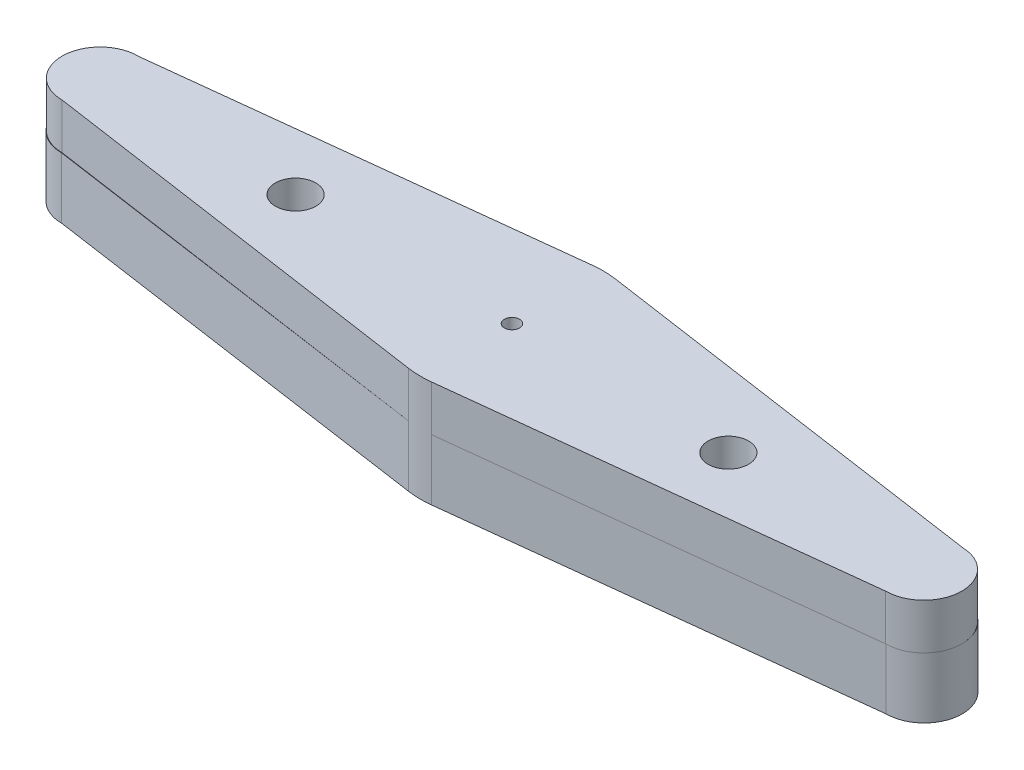
ISO-10303-21;
HEADER;
FILE_DESCRIPTION(('STEP AP214'),'2;1');
FILE_NAME('part.step','',(''),(''),'','','');
FILE_SCHEMA(('AUTOMOTIVE_DESIGN { 1 0 10303 214 1 1 1 1 }'));
ENDSEC;
DATA;
#1=APPLICATION_CONTEXT('core data for automotive mechanical design processes');
#2=APPLICATION_PROTOCOL_DEFINITION('international standard','automotive_design',2000,#1);
#3=PRODUCT_CONTEXT('',#1,'mechanical');
#4=PRODUCT('Part','Part','',(#3));
#5=PRODUCT_RELATED_PRODUCT_CATEGORY('part','',(#4));
#6=PRODUCT_DEFINITION_FORMATION('','',#4);
#7=PRODUCT_DEFINITION_CONTEXT('part definition',#1,'design');
#8=PRODUCT_DEFINITION('design','',#6,#7);
#9=PRODUCT_DEFINITION_SHAPE('','',#8);
#10=(LENGTH_UNIT() NAMED_UNIT(*) SI_UNIT(.MILLI.,.METRE.));
#11=(NAMED_UNIT(*) PLANE_ANGLE_UNIT() SI_UNIT($,.RADIAN.));
#12=(NAMED_UNIT(*) SI_UNIT($,.STERADIAN.) SOLID_ANGLE_UNIT());
#13=UNCERTAINTY_MEASURE_WITH_UNIT(LENGTH_MEASURE(1.E-05),#10,'distance_accuracy_value','');
#14=(GEOMETRIC_REPRESENTATION_CONTEXT(3) GLOBAL_UNCERTAINTY_ASSIGNED_CONTEXT((#13)) GLOBAL_UNIT_ASSIGNED_CONTEXT((#10,
#11,#12)) REPRESENTATION_CONTEXT('',''));
#15=CARTESIAN_POINT('',(0.,0.,0.));
#16=DIRECTION('',(0.,0.,1.));
#17=DIRECTION('',(1.,0.,0.));
#18=AXIS2_PLACEMENT_3D('',#15,#16,#17);
#19=CARTESIAN_POINT('',(0.,4.,0.));
#20=DIRECTION('',(0.,1.,0.));
#21=DIRECTION('',(0.,0.,1.));
#22=AXIS2_PLACEMENT_3D('',#19,#20,#21);
#23=PLANE('',#22);
#24=DIRECTION('',(0.989540809967866,0.,0.14425319895288));
#25=VECTOR('',#24,1.);
#26=CARTESIAN_POINT('',(-27.5,4.,2.0545257035552));
#27=LINE('',#26,#25);
#28=CARTESIAN_POINT('',(-27.5,4.,2.0545257035552));
#29=VERTEX_POINT('',#28);
#30=CARTESIAN_POINT('',(-0.865519644754594,4.,5.93724797617368));
#31=VERTEX_POINT('',#30);
#32=EDGE_CURVE('E66',#29,#31,#27,.T.);
#33=ORIENTED_EDGE('',*,*,#32,.F.);
#34=CARTESIAN_POINT('',(-27.5,4.,-0.445474296444802));
#35=DIRECTION('',(0.,1.,0.));
#36=DIRECTION('',(0.,0.,1.));
#37=AXIS2_PLACEMENT_3D('',#34,#35,#36);
#38=CIRCLE('',#37,2.5);
#39=CARTESIAN_POINT('',(-29.9999611737233,4.,-0.43154124667489));
#40=VERTEX_POINT('',#39);
#41=EDGE_CURVE('E11',#40,#29,#38,.T.);
#42=ORIENTED_EDGE('',*,*,#41,.F.);
#43=CARTESIAN_POINT('',(-27.5,4.,-0.417608196903733));
#44=DIRECTION('',(0.,1.,0.));
#45=DIRECTION('',(0.,0.,1.));
#46=AXIS2_PLACEMENT_3D('',#43,#44,#45);
#47=CIRCLE('',#46,2.5);
#48=CARTESIAN_POINT('',(-27.5,4.,2.08239180309627));
#49=VERTEX_POINT('',#48);
#50=EDGE_CURVE('E295',#40,#49,#47,.T.);
#51=ORIENTED_EDGE('',*,*,#50,.T.);
#52=DIRECTION('',(0.98968807888541,0.,0.143239332978434));
#53=VECTOR('',#52,1.);
#54=CARTESIAN_POINT('',(-0.859435997870602,4.,5.93812847331245));
#55=LINE('',#54,#53);
#56=EDGE_CURVE('E300',#49,#31,#55,.T.);
#57=ORIENTED_EDGE('',*,*,#56,.T.);
#58=EDGE_LOOP('',(#33,#42,#51,#57));
#59=FACE_BOUND('',#58,.T.);
#60=ADVANCED_FACE('F47',(#59),#23,.T.);
#61=CARTESIAN_POINT('',(0.85729501097825,4.,-5.93843794816043));
#62=DIRECTION('',(-0.142882501829708,0.,0.989739658026738));
#63=DIRECTION('',(0.989739658026738,0.,0.142882501829708));
#64=AXIS2_PLACEMENT_3D('',#61,#62,#63);
#65=PLANE('',#64);
#66=DIRECTION('',(-0.989739658026738,0.,-0.142882501829708));
#67=VECTOR('',#66,1.);
#68=CARTESIAN_POINT('',(0.85729501097825,0.,-5.93843794816043));
#69=LINE('',#68,#67);
#70=CARTESIAN_POINT('',(27.5759112573998,0.,-2.08123903352073));
#71=VERTEX_POINT('',#70);
#72=CARTESIAN_POINT('',(0.857295010978249,0.,-5.93843794816043));
#73=VERTEX_POINT('',#72);
#74=EDGE_CURVE('E340',#71,#73,#69,.T.);
#75=ORIENTED_EDGE('',*,*,#74,.T.);
#76=DIRECTION('',(0.,-1.,0.));
#77=VECTOR('',#76,1.);
#78=CARTESIAN_POINT('',(0.857295010978249,4.,-5.93843794816043));
#79=LINE('',#78,#77);
#80=CARTESIAN_POINT('',(0.857295010978249,4.,-5.93843794816043));
#81=VERTEX_POINT('',#80);
#82=EDGE_CURVE('E392',#81,#73,#79,.T.);
#83=ORIENTED_EDGE('',*,*,#82,.F.);
#84=CARTESIAN_POINT('',(0.,4.,0.));
#85=DIRECTION('',(0.,1.,0.));
#86=DIRECTION('',(0.,0.,1.));
#87=AXIS2_PLACEMENT_3D('',#84,#85,#86);
#88=CIRCLE('',#87,6.);
#89=CARTESIAN_POINT('',(0.863235762787025,4.,-5.93757728521032));
#90=VERTEX_POINT('',#89);
#91=EDGE_CURVE('E497',#90,#81,#88,.T.);
#92=ORIENTED_EDGE('',*,*,#91,.F.);
#93=DIRECTION('',(-0.989739658026738,0.,-0.142882501829708));
#94=VECTOR('',#93,1.);
#95=CARTESIAN_POINT('',(0.85729501097825,4.,-5.93843794816043));
#96=LINE('',#95,#94);
#97=CARTESIAN_POINT('',(27.5759112573998,4.,-2.08123903352073));
#98=VERTEX_POINT('',#97);
#99=EDGE_CURVE('E288',#98,#90,#96,.T.);
#100=ORIENTED_EDGE('',*,*,#99,.F.);
#101=DIRECTION('',(0.,-1.,0.));
#102=VECTOR('',#101,1.);
#103=CARTESIAN_POINT('',(27.5759112573998,4.,-2.08123903352073));
#104=LINE('',#103,#102);
#105=EDGE_CURVE('E368',#98,#71,#104,.T.);
#106=ORIENTED_EDGE('',*,*,#105,.T.);
#107=EDGE_LOOP('',(#75,#83,#92,#100,#106));
#108=FACE_BOUND('',#107,.T.);
#109=ADVANCED_FACE('F458',(#108),#65,.F.);
#110=CARTESIAN_POINT('',(0.,4.,0.));
#111=DIRECTION('',(0.,-1.,0.));
#112=DIRECTION('',(0.,0.,-1.));
#113=AXIS2_PLACEMENT_3D('',#110,#111,#112);
#114=CYLINDRICAL_SURFACE('',#113,6.);
#115=CARTESIAN_POINT('',(0.,0.,0.));
#116=DIRECTION('',(0.,1.,0.));
#117=DIRECTION('',(0.,0.,1.));
#118=AXIS2_PLACEMENT_3D('',#115,#116,#117);
#119=CIRCLE('',#118,6.);
#120=CARTESIAN_POINT('',(-0.678731385598108,0.,-5.96148670267778));
#121=VERTEX_POINT('',#120);
#122=EDGE_CURVE('E344',#73,#121,#119,.T.);
#123=ORIENTED_EDGE('',*,*,#122,.T.);
#124=DIRECTION('',(0.,-1.,0.));
#125=VECTOR('',#124,1.);
#126=CARTESIAN_POINT('',(-0.678731385598108,4.,-5.96148670267778));
#127=LINE('',#126,#125);
#128=CARTESIAN_POINT('',(-0.678731385598108,4.,-5.96148670267778));
#129=VERTEX_POINT('',#128);
#130=EDGE_CURVE('E389',#129,#121,#127,.T.);
#131=ORIENTED_EDGE('',*,*,#130,.F.);
#132=DIRECTION('',(-0.993693923888226,0.,0.112126649943809));
#133=VECTOR('',#132,1.);
#134=CARTESIAN_POINT('',(-27.4190259217587,4.,-2.94416259206172));
#135=LINE('',#134,#133);
#136=CARTESIAN_POINT('',(-0.672759899662852,4.,-5.96216354332936));
#137=VERTEX_POINT('',#136);
#138=EDGE_CURVE('E509',#137,#129,#135,.T.);
#139=ORIENTED_EDGE('',*,*,#138,.F.);
#140=DIRECTION('',(0.,-1.,0.));
#141=VECTOR('',#140,1.);
#142=CARTESIAN_POINT('',(-0.672759899662852,7.,-5.96216354332935));
#143=LINE('',#142,#141);
#144=CARTESIAN_POINT('',(-0.672759899662852,7.,-5.96216354332935));
#145=VERTEX_POINT('',#144);
#146=EDGE_CURVE('E252',#145,#137,#143,.T.);
#147=ORIENTED_EDGE('',*,*,#146,.F.);
#148=CARTESIAN_POINT('',(0.,7.,0.));
#149=DIRECTION('',(0.,1.,0.));
#150=DIRECTION('',(0.,0.,1.));
#151=AXIS2_PLACEMENT_3D('',#148,#149,#150);
#152=CIRCLE('',#151,6.);
#153=CARTESIAN_POINT('',(0.863235762787025,7.,-5.93757728521032));
#154=VERTEX_POINT('',#153);
#155=EDGE_CURVE('E228',#154,#145,#152,.T.);
#156=ORIENTED_EDGE('',*,*,#155,.F.);
#157=DIRECTION('',(0.,-1.,0.));
#158=VECTOR('',#157,1.);
#159=CARTESIAN_POINT('',(0.863235762787025,7.,-5.93757728521032));
#160=LINE('',#159,#158);
#161=EDGE_CURVE('E224',#154,#90,#160,.T.);
#162=ORIENTED_EDGE('',*,*,#161,.T.);
#163=ORIENTED_EDGE('',*,*,#91,.T.);
#164=ORIENTED_EDGE('',*,*,#82,.T.);
#165=EDGE_LOOP('',(#123,#131,#139,#147,#156,#162,#163,#164));
#166=FACE_BOUND('',#165,.T.);
#167=ADVANCED_FACE('F465',(#166),#114,.T.);
#168=CARTESIAN_POINT('',(-0.678731385598108,4.,-5.96148670267778));
#169=DIRECTION('',(-0.113121897599685,0.,-0.993581117112965));
#170=DIRECTION('',(-0.993581117112965,0.,0.113121897599685));
#171=AXIS2_PLACEMENT_3D('',#168,#169,#170);
#172=PLANE('',#171);
#173=DIRECTION('',(0.993581117112964,0.,-0.113121897599685));
#174=VECTOR('',#173,1.);
#175=CARTESIAN_POINT('',(-0.678731385598108,0.,-5.96148670267778));
#176=LINE('',#175,#174);
#177=CARTESIAN_POINT('',(-27.4240887426002,0.,-2.91645542732819));
#178=VERTEX_POINT('',#177);
#179=EDGE_CURVE('E348',#178,#121,#176,.T.);
#180=ORIENTED_EDGE('',*,*,#179,.F.);
#181=DIRECTION('',(0.,-1.,0.));
#182=VECTOR('',#181,1.);
#183=CARTESIAN_POINT('',(-27.4240887426002,4.,-2.91645542732819));
#184=LINE('',#183,#182);
#185=CARTESIAN_POINT('',(-27.4240887426002,4.,-2.91645542732819));
#186=VERTEX_POINT('',#185);
#187=EDGE_CURVE('E386',#186,#178,#184,.T.);
#188=ORIENTED_EDGE('',*,*,#187,.F.);
#189=DIRECTION('',(0.993581117112964,0.,-0.113121897599685));
#190=VECTOR('',#189,1.);
#191=CARTESIAN_POINT('',(-0.678731385598108,4.,-5.96148670267778));
#192=LINE('',#191,#190);
#193=EDGE_CURVE('E291',#186,#129,#192,.T.);
#194=ORIENTED_EDGE('',*,*,#193,.T.);
#195=ORIENTED_EDGE('',*,*,#130,.T.);
#196=EDGE_LOOP('',(#180,#188,#194,#195));
#197=FACE_BOUND('',#196,.T.);
#198=ADVANCED_FACE('F555',(#197),#172,.T.);
#199=CARTESIAN_POINT('',(-27.5,4.,-0.417608196903733));
#200=DIRECTION('',(0.,-1.,0.));
#201=DIRECTION('',(0.,0.,-1.));
#202=AXIS2_PLACEMENT_3D('',#199,#200,#201);
#203=CYLINDRICAL_SURFACE('',#202,2.5);
#204=CARTESIAN_POINT('',(-27.5,0.,-0.417608196903733));
#205=DIRECTION('',(0.,1.,0.));
#206=DIRECTION('',(0.,0.,1.));
#207=AXIS2_PLACEMENT_3D('',#204,#205,#206);
#208=CIRCLE('',#207,2.5);
#209=CARTESIAN_POINT('',(-27.5,0.,2.08239180309627));
#210=VERTEX_POINT('',#209);
#211=EDGE_CURVE('E352',#178,#210,#208,.T.);
#212=ORIENTED_EDGE('',*,*,#211,.T.);
#213=DIRECTION('',(0.,-1.,0.));
#214=VECTOR('',#213,1.);
#215=CARTESIAN_POINT('',(-27.5,4.,2.08239180309627));
#216=LINE('',#215,#214);
#217=EDGE_CURVE('E382',#49,#210,#216,.T.);
#218=ORIENTED_EDGE('',*,*,#217,.F.);
#219=ORIENTED_EDGE('',*,*,#50,.F.);
#220=EDGE_CURVE('E296',#186,#40,#47,.T.);
#221=ORIENTED_EDGE('',*,*,#220,.F.);
#222=ORIENTED_EDGE('',*,*,#187,.T.);
#223=EDGE_LOOP('',(#212,#218,#219,#221,#222));
#224=FACE_BOUND('',#223,.T.);
#225=ADVANCED_FACE('F804',(#224),#203,.T.);
#226=CARTESIAN_POINT('',(-0.859435997870602,4.,5.93812847331245));
#227=DIRECTION('',(0.143239332978434,0.,-0.98968807888541));
#228=DIRECTION('',(-0.98968807888541,0.,-0.143239332978434));
#229=AXIS2_PLACEMENT_3D('',#226,#227,#228);
#230=PLANE('',#229);
#231=DIRECTION('',(0.98968807888541,0.,0.143239332978434));
#232=VECTOR('',#231,1.);
#233=CARTESIAN_POINT('',(-0.859435997870602,0.,5.93812847331245));
#234=LINE('',#233,#232);
#235=CARTESIAN_POINT('',(-0.859435997870602,0.,5.93812847331245));
#236=VERTEX_POINT('',#235);
#237=EDGE_CURVE('E355',#210,#236,#234,.T.);
#238=ORIENTED_EDGE('',*,*,#237,.T.);
#239=DIRECTION('',(0.,-1.,0.));
#240=VECTOR('',#239,1.);
#241=CARTESIAN_POINT('',(-0.859435997870602,4.,5.93812847331245));
#242=LINE('',#241,#240);
#243=CARTESIAN_POINT('',(-0.859435997870602,4.,5.93812847331245));
#244=VERTEX_POINT('',#243);
#245=EDGE_CURVE('E378',#244,#236,#242,.T.);
#246=ORIENTED_EDGE('',*,*,#245,.F.);
#247=CARTESIAN_POINT('',(0.,4.,0.));
#248=DIRECTION('',(0.,1.,0.));
#249=DIRECTION('',(0.,0.,1.));
#250=AXIS2_PLACEMENT_3D('',#247,#248,#249);
#251=CIRCLE('',#250,6.);
#252=EDGE_CURVE('E517',#31,#244,#251,.T.);
#253=ORIENTED_EDGE('',*,*,#252,.F.);
#254=ORIENTED_EDGE('',*,*,#56,.F.);
#255=ORIENTED_EDGE('',*,*,#217,.T.);
#256=EDGE_LOOP('',(#238,#246,#253,#254,#255));
#257=FACE_BOUND('',#256,.T.);
#258=ADVANCED_FACE('F795',(#257),#230,.F.);
#259=CARTESIAN_POINT('',(0.,4.,0.));
#260=DIRECTION('',(0.,-1.,0.));
#261=DIRECTION('',(0.,0.,-1.));
#262=AXIS2_PLACEMENT_3D('',#259,#260,#261);
#263=CYLINDRICAL_SURFACE('',#262,6.);
#264=CARTESIAN_POINT('',(0.,0.,0.));
#265=DIRECTION('',(0.,1.,0.));
#266=DIRECTION('',(0.,0.,1.));
#267=AXIS2_PLACEMENT_3D('',#264,#265,#266);
#268=CIRCLE('',#267,6.);
#269=CARTESIAN_POINT('',(0.676581988881639,0.,5.96173102482165));
#270=VERTEX_POINT('',#269);
#271=EDGE_CURVE('E358',#236,#270,#268,.T.);
#272=ORIENTED_EDGE('',*,*,#271,.T.);
#273=DIRECTION('',(0.,-1.,0.));
#274=VECTOR('',#273,1.);
#275=CARTESIAN_POINT('',(0.676581988881639,4.,5.96173102482165));
#276=LINE('',#275,#274);
#277=CARTESIAN_POINT('',(0.676581988881639,4.,5.96173102482165));
#278=VERTEX_POINT('',#277);
#279=EDGE_CURVE('E375',#278,#270,#276,.T.);
#280=ORIENTED_EDGE('',*,*,#279,.F.);
#281=DIRECTION('',(0.993736972471501,0.,-0.111744483278484));
#282=VECTOR('',#281,1.);
#283=CARTESIAN_POINT('',(27.5,4.,2.9454742964448));
#284=LINE('',#283,#282);
#285=CARTESIAN_POINT('',(0.670466899670907,4.,5.962421834829));
#286=VERTEX_POINT('',#285);
#287=EDGE_CURVE('E240',#286,#278,#284,.T.);
#288=ORIENTED_EDGE('',*,*,#287,.F.);
#289=DIRECTION('',(0.,-1.,0.));
#290=VECTOR('',#289,1.);
#291=CARTESIAN_POINT('',(0.670466899670907,7.,5.962421834829));
#292=LINE('',#291,#290);
#293=CARTESIAN_POINT('',(0.670466899670907,7.,5.962421834829));
#294=VERTEX_POINT('',#293);
#295=EDGE_CURVE('E527',#294,#286,#292,.T.);
#296=ORIENTED_EDGE('',*,*,#295,.F.);
#297=CARTESIAN_POINT('',(0.,7.,0.));
#298=DIRECTION('',(0.,1.,0.));
#299=DIRECTION('',(0.,0.,1.));
#300=AXIS2_PLACEMENT_3D('',#297,#298,#299);
#301=CIRCLE('',#300,6.);
#302=CARTESIAN_POINT('',(-0.865519193717277,7.,5.9372448598072));
#303=VERTEX_POINT('',#302);
#304=EDGE_CURVE('E572',#303,#294,#301,.T.);
#305=ORIENTED_EDGE('',*,*,#304,.F.);
#306=DIRECTION('',(0.,-1.,0.));
#307=VECTOR('',#306,1.);
#308=CARTESIAN_POINT('',(-0.865519193717277,7.,5.9372448598072));
#309=LINE('',#308,#307);
#310=EDGE_CURVE('E531',#303,#31,#309,.T.);
#311=ORIENTED_EDGE('',*,*,#310,.T.);
#312=ORIENTED_EDGE('',*,*,#252,.T.);
#313=ORIENTED_EDGE('',*,*,#245,.T.);
#314=EDGE_LOOP('',(#272,#280,#288,#296,#305,#311,#312,#313));
#315=FACE_BOUND('',#314,.T.);
#316=ADVANCED_FACE('F786',(#315),#263,.T.);
#317=CARTESIAN_POINT('',(0.676581988881639,4.,5.96173102482165));
#318=DIRECTION('',(0.112763664813606,0.,0.993621837470274));
#319=DIRECTION('',(0.993621837470275,0.,-0.112763664813607));
#320=AXIS2_PLACEMENT_3D('',#317,#318,#319);
#321=PLANE('',#320);
#322=DIRECTION('',(-0.993621837470275,0.,0.112763664813607));
#323=VECTOR('',#322,1.);
#324=CARTESIAN_POINT('',(0.676581988881639,0.,5.96173102482165));
#325=LINE('',#324,#323);
#326=CARTESIAN_POINT('',(27.5,0.,2.91760819690373));
#327=VERTEX_POINT('',#326);
#328=EDGE_CURVE('E362',#327,#270,#325,.T.);
#329=ORIENTED_EDGE('',*,*,#328,.F.);
#330=DIRECTION('',(0.,-1.,0.));
#331=VECTOR('',#330,1.);
#332=CARTESIAN_POINT('',(27.5,4.,2.91760819690373));
#333=LINE('',#332,#331);
#334=CARTESIAN_POINT('',(27.5,4.,2.91760819690373));
#335=VERTEX_POINT('',#334);
#336=EDGE_CURVE('E372',#335,#327,#333,.T.);
#337=ORIENTED_EDGE('',*,*,#336,.F.);
#338=DIRECTION('',(-0.993621837470275,0.,0.112763664813607));
#339=VECTOR('',#338,1.);
#340=CARTESIAN_POINT('',(0.676581988881639,4.,5.96173102482165));
#341=LINE('',#340,#339);
#342=EDGE_CURVE('E303',#335,#278,#341,.T.);
#343=ORIENTED_EDGE('',*,*,#342,.T.);
#344=ORIENTED_EDGE('',*,*,#279,.T.);
#345=EDGE_LOOP('',(#329,#337,#343,#344));
#346=FACE_BOUND('',#345,.T.);
#347=ADVANCED_FACE('F779',(#346),#321,.T.);
#348=CARTESIAN_POINT('',(0.,4.,0.));
#349=DIRECTION('',(0.,-1.,0.));
#350=DIRECTION('',(0.,0.,-1.));
#351=AXIS2_PLACEMENT_3D('',#348,#349,#350);
#352=CYLINDRICAL_SURFACE('',#351,3.75);
#353=CARTESIAN_POINT('',(0.,0.,0.));
#354=DIRECTION('',(0.,1.,0.));
#355=DIRECTION('',(0.,0.,1.));
#356=AXIS2_PLACEMENT_3D('',#353,#354,#355);
#357=CIRCLE('',#356,3.75);
#358=CARTESIAN_POINT('',(0.873759552357188,0.,-3.64678546732113));
#359=VERTEX_POINT('',#358);
#360=CARTESIAN_POINT('',(-0.65313587016745,0.,-3.69268378487796));
#361=VERTEX_POINT('',#360);
#362=EDGE_CURVE('E245',#359,#361,#357,.T.);
#363=ORIENTED_EDGE('',*,*,#362,.F.);
#364=DIRECTION('',(0.,-1.,0.));
#365=VECTOR('',#364,1.);
#366=CARTESIAN_POINT('',(0.873759552357188,4.,-3.64678546732113));
#367=LINE('',#366,#365);
#368=CARTESIAN_POINT('',(0.873759552357188,4.,-3.64678546732113));
#369=VERTEX_POINT('',#368);
#370=EDGE_CURVE('E51',#369,#359,#367,.T.);
#371=ORIENTED_EDGE('',*,*,#370,.F.);
#372=CARTESIAN_POINT('',(0.,4.,0.));
#373=DIRECTION('',(0.,1.,0.));
#374=DIRECTION('',(0.,0.,1.));
#375=AXIS2_PLACEMENT_3D('',#372,#373,#374);
#376=CIRCLE('',#375,3.75);
#377=CARTESIAN_POINT('',(-0.65313587016745,4.,-3.69268378487796));
#378=VERTEX_POINT('',#377);
#379=EDGE_CURVE('E256',#369,#378,#376,.T.);
#380=ORIENTED_EDGE('',*,*,#379,.T.);
#381=DIRECTION('',(0.,-1.,0.));
#382=VECTOR('',#381,1.);
#383=CARTESIAN_POINT('',(-0.65313587016745,4.,-3.69268378487796));
#384=LINE('',#383,#382);
#385=EDGE_CURVE('E311',#378,#361,#384,.T.);
#386=ORIENTED_EDGE('',*,*,#385,.T.);
#387=EDGE_LOOP('',(#363,#371,#380,#386));
#388=FACE_BOUND('',#387,.T.);
#389=ADVANCED_FACE('F49',(#388),#352,.F.);
#390=CARTESIAN_POINT('',(0.436879776178597,4.,-3.69839273366056));
#391=DIRECTION('',(0.117311285435446,0.,-0.993095192974713));
#392=DIRECTION('',(-0.993095192974713,0.,-0.117311285435446));
#393=AXIS2_PLACEMENT_3D('',#390,#391,#392);
#394=PLANE('',#393);
#395=DIRECTION('',(0.993095192974713,0.,0.117311285435446));
#396=VECTOR('',#395,1.);
#397=CARTESIAN_POINT('',(0.436879776178597,0.,-3.69839273366056));
#398=LINE('',#397,#396);
#399=CARTESIAN_POINT('',(17.,0.,-1.74184220555042));
#400=VERTEX_POINT('',#399);
#401=EDGE_CURVE('E250',#359,#400,#398,.T.);
#402=ORIENTED_EDGE('',*,*,#401,.T.);
#403=DIRECTION('',(0.,-1.,0.));
#404=VECTOR('',#403,1.);
#405=CARTESIAN_POINT('',(17.,4.,-1.74184220555042));
#406=LINE('',#405,#404);
#407=CARTESIAN_POINT('',(17.,4.,-1.74184220555042));
#408=VERTEX_POINT('',#407);
#409=EDGE_CURVE('E412',#408,#400,#406,.T.);
#410=ORIENTED_EDGE('',*,*,#409,.F.);
#411=DIRECTION('',(0.993095192974713,0.,0.117311285435446));
#412=VECTOR('',#411,1.);
#413=CARTESIAN_POINT('',(0.436879776178597,4.,-3.69839273366056));
#414=LINE('',#413,#412);
#415=EDGE_CURVE('E259',#369,#408,#414,.T.);
#416=ORIENTED_EDGE('',*,*,#415,.F.);
#417=ORIENTED_EDGE('',*,*,#370,.T.);
#418=EDGE_LOOP('',(#402,#410,#416,#417));
#419=FACE_BOUND('',#418,.T.);
#420=ADVANCED_FACE('F420',(#419),#394,.F.);
#421=CARTESIAN_POINT('',(17.,4.,0.258157794449581));
#422=DIRECTION('',(0.,-1.,0.));
#423=DIRECTION('',(0.,0.,-1.));
#424=AXIS2_PLACEMENT_3D('',#421,#422,#423);
#425=CYLINDRICAL_SURFACE('',#424,2.);
#426=CARTESIAN_POINT('',(17.,0.,0.258157794449581));
#427=DIRECTION('',(0.,1.,0.));
#428=DIRECTION('',(0.,0.,1.));
#429=AXIS2_PLACEMENT_3D('',#426,#427,#428);
#430=CIRCLE('',#429,2.);
#431=CARTESIAN_POINT('',(17.,0.,2.25815779444958));
#432=VERTEX_POINT('',#431);
#433=EDGE_CURVE('E316',#432,#400,#430,.T.);
#434=ORIENTED_EDGE('',*,*,#433,.F.);
#435=DIRECTION('',(0.,-1.,0.));
#436=VECTOR('',#435,1.);
#437=CARTESIAN_POINT('',(17.,4.,2.25815779444958));
#438=LINE('',#437,#436);
#439=CARTESIAN_POINT('',(17.,4.,2.25815779444958));
#440=VERTEX_POINT('',#439);
#441=EDGE_CURVE('E410',#440,#432,#438,.T.);
#442=ORIENTED_EDGE('',*,*,#441,.F.);
#443=CARTESIAN_POINT('',(17.,4.,0.258157794449581));
#444=DIRECTION('',(0.,1.,0.));
#445=DIRECTION('',(0.,0.,1.));
#446=AXIS2_PLACEMENT_3D('',#443,#444,#445);
#447=CIRCLE('',#446,2.);
#448=EDGE_CURVE('E264',#440,#408,#447,.T.);
#449=ORIENTED_EDGE('',*,*,#448,.T.);
#450=ORIENTED_EDGE('',*,*,#409,.T.);
#451=EDGE_LOOP('',(#434,#442,#449,#450));
#452=FACE_BOUND('',#451,.T.);
#453=ADVANCED_FACE('F449',(#452),#425,.F.);
#454=CARTESIAN_POINT('',(0.326567935083726,4.,3.72134189243898));
#455=DIRECTION('',(-0.0874194601691877,0.,-0.996171590632722));
#456=DIRECTION('',(-0.996171590632722,0.,0.0874194601691877));
#457=AXIS2_PLACEMENT_3D('',#454,#455,#456);
#458=PLANE('',#457);
#459=DIRECTION('',(0.996171590632722,0.,-0.0874194601691877));
#460=VECTOR('',#459,1.);
#461=CARTESIAN_POINT('',(0.326567935083726,0.,3.72134189243898));
#462=LINE('',#461,#460);
#463=CARTESIAN_POINT('',(0.65313587016745,0.,3.69268378487796));
#464=VERTEX_POINT('',#463);
#465=EDGE_CURVE('E320',#464,#432,#462,.T.);
#466=ORIENTED_EDGE('',*,*,#465,.F.);
#467=DIRECTION('',(0.,-1.,0.));
#468=VECTOR('',#467,1.);
#469=CARTESIAN_POINT('',(0.65313587016745,4.,3.69268378487796));
#470=LINE('',#469,#468);
#471=CARTESIAN_POINT('',(0.65313587016745,4.,3.69268378487796));
#472=VERTEX_POINT('',#471);
#473=EDGE_CURVE('E407',#472,#464,#470,.T.);
#474=ORIENTED_EDGE('',*,*,#473,.F.);
#475=DIRECTION('',(0.996171590632722,0.,-0.0874194601691877));
#476=VECTOR('',#475,1.);
#477=CARTESIAN_POINT('',(0.326567935083726,4.,3.72134189243898));
#478=LINE('',#477,#476);
#479=EDGE_CURVE('E268',#472,#440,#478,.T.);
#480=ORIENTED_EDGE('',*,*,#479,.T.);
#481=ORIENTED_EDGE('',*,*,#441,.T.);
#482=EDGE_LOOP('',(#466,#474,#480,#481));
#483=FACE_BOUND('',#482,.T.);
#484=ADVANCED_FACE('F447',(#483),#458,.T.);
#485=CARTESIAN_POINT('',(0.,4.,0.));
#486=DIRECTION('',(0.,-1.,0.));
#487=DIRECTION('',(0.,0.,-1.));
#488=AXIS2_PLACEMENT_3D('',#485,#486,#487);
#489=CYLINDRICAL_SURFACE('',#488,3.75);
#490=CARTESIAN_POINT('',(0.,0.,0.));
#491=DIRECTION('',(0.,1.,0.));
#492=DIRECTION('',(0.,0.,1.));
#493=AXIS2_PLACEMENT_3D('',#490,#491,#492);
#494=CIRCLE('',#493,3.75);
#495=CARTESIAN_POINT('',(-0.873759552357192,0.,3.64678546732113));
#496=VERTEX_POINT('',#495);
#497=EDGE_CURVE('E324',#496,#464,#494,.T.);
#498=ORIENTED_EDGE('',*,*,#497,.F.);
#499=DIRECTION('',(0.,-1.,0.));
#500=VECTOR('',#499,1.);
#501=CARTESIAN_POINT('',(-0.873759552357192,4.,3.64678546732113));
#502=LINE('',#501,#500);
#503=CARTESIAN_POINT('',(-0.873759552357192,4.,3.64678546732113));
#504=VERTEX_POINT('',#503);
#505=EDGE_CURVE('E404',#504,#496,#502,.T.);
#506=ORIENTED_EDGE('',*,*,#505,.F.);
#507=CARTESIAN_POINT('',(0.,4.,0.));
#508=DIRECTION('',(0.,1.,0.));
#509=DIRECTION('',(0.,0.,1.));
#510=AXIS2_PLACEMENT_3D('',#507,#508,#509);
#511=CIRCLE('',#510,3.75);
#512=EDGE_CURVE('E272',#504,#472,#511,.T.);
#513=ORIENTED_EDGE('',*,*,#512,.T.);
#514=ORIENTED_EDGE('',*,*,#473,.T.);
#515=EDGE_LOOP('',(#498,#506,#513,#514));
#516=FACE_BOUND('',#515,.T.);
#517=ADVANCED_FACE('F443',(#516),#489,.F.);
#518=CARTESIAN_POINT('',(-0.436879776178597,4.,3.69839273366056));
#519=DIRECTION('',(0.117311285435446,0.,-0.993095192974713));
#520=DIRECTION('',(-0.993095192974713,0.,-0.117311285435446));
#521=AXIS2_PLACEMENT_3D('',#518,#519,#520);
#522=PLANE('',#521);
#523=DIRECTION('',(0.993095192974713,0.,0.117311285435446));
#524=VECTOR('',#523,1.);
#525=CARTESIAN_POINT('',(-0.436879776178597,0.,3.69839273366056));
#526=LINE('',#525,#524);
#527=CARTESIAN_POINT('',(-17.,0.,1.74184220555042));
#528=VERTEX_POINT('',#527);
#529=EDGE_CURVE('E328',#528,#496,#526,.T.);
#530=ORIENTED_EDGE('',*,*,#529,.F.);
#531=DIRECTION('',(0.,-1.,0.));
#532=VECTOR('',#531,1.);
#533=CARTESIAN_POINT('',(-17.,4.,1.74184220555042));
#534=LINE('',#533,#532);
#535=CARTESIAN_POINT('',(-17.,4.,1.74184220555042));
#536=VERTEX_POINT('',#535);
#537=EDGE_CURVE('E401',#536,#528,#534,.T.);
#538=ORIENTED_EDGE('',*,*,#537,.F.);
#539=DIRECTION('',(0.993095192974713,0.,0.117311285435446));
#540=VECTOR('',#539,1.);
#541=CARTESIAN_POINT('',(-0.436879776178597,4.,3.69839273366056));
#542=LINE('',#541,#540);
#543=EDGE_CURVE('E276',#536,#504,#542,.T.);
#544=ORIENTED_EDGE('',*,*,#543,.T.);
#545=ORIENTED_EDGE('',*,*,#505,.T.);
#546=EDGE_LOOP('',(#530,#538,#544,#545));
#547=FACE_BOUND('',#546,.T.);
#548=ADVANCED_FACE('F439',(#547),#522,.T.);
#549=CARTESIAN_POINT('',(-17.,4.,-0.25815779444958));
#550=DIRECTION('',(0.,-1.,0.));
#551=DIRECTION('',(0.,0.,-1.));
#552=AXIS2_PLACEMENT_3D('',#549,#550,#551);
#553=CYLINDRICAL_SURFACE('',#552,2.);
#554=CARTESIAN_POINT('',(-17.,0.,-0.25815779444958));
#555=DIRECTION('',(0.,1.,0.));
#556=DIRECTION('',(0.,0.,1.));
#557=AXIS2_PLACEMENT_3D('',#554,#555,#556);
#558=CIRCLE('',#557,2.);
#559=CARTESIAN_POINT('',(-17.,0.,-2.25815779444958));
#560=VERTEX_POINT('',#559);
#561=EDGE_CURVE('E332',#560,#528,#558,.T.);
#562=ORIENTED_EDGE('',*,*,#561,.F.);
#563=DIRECTION('',(0.,-1.,0.));
#564=VECTOR('',#563,1.);
#565=CARTESIAN_POINT('',(-17.,4.,-2.25815779444958));
#566=LINE('',#565,#564);
#567=CARTESIAN_POINT('',(-17.,4.,-2.25815779444958));
#568=VERTEX_POINT('',#567);
#569=EDGE_CURVE('E398',#568,#560,#566,.T.);
#570=ORIENTED_EDGE('',*,*,#569,.F.);
#571=CARTESIAN_POINT('',(-17.,4.,-0.25815779444958));
#572=DIRECTION('',(0.,1.,0.));
#573=DIRECTION('',(0.,0.,1.));
#574=AXIS2_PLACEMENT_3D('',#571,#572,#573);
#575=CIRCLE('',#574,2.);
#576=EDGE_CURVE('E280',#568,#536,#575,.T.);
#577=ORIENTED_EDGE('',*,*,#576,.T.);
#578=ORIENTED_EDGE('',*,*,#537,.T.);
#579=EDGE_LOOP('',(#562,#570,#577,#578));
#580=FACE_BOUND('',#579,.T.);
#581=ADVANCED_FACE('F434',(#580),#553,.F.);
#582=CARTESIAN_POINT('',(-0.326567935083726,4.,-3.72134189243898));
#583=DIRECTION('',(-0.0874194601691876,0.,-0.996171590632722));
#584=DIRECTION('',(-0.996171590632722,0.,0.0874194601691876));
#585=AXIS2_PLACEMENT_3D('',#582,#583,#584);
#586=PLANE('',#585);
#587=DIRECTION('',(0.996171590632722,0.,-0.0874194601691876));
#588=VECTOR('',#587,1.);
#589=CARTESIAN_POINT('',(-0.326567935083726,0.,-3.72134189243898));
#590=LINE('',#589,#588);
#591=EDGE_CURVE('E336',#560,#361,#590,.T.);
#592=ORIENTED_EDGE('',*,*,#591,.T.);
#593=ORIENTED_EDGE('',*,*,#385,.F.);
#594=DIRECTION('',(0.996171590632722,0.,-0.0874194601691876));
#595=VECTOR('',#594,1.);
#596=CARTESIAN_POINT('',(-0.326567935083726,4.,-3.72134189243898));
#597=LINE('',#596,#595);
#598=EDGE_CURVE('E284',#568,#378,#597,.T.);
#599=ORIENTED_EDGE('',*,*,#598,.F.);
#600=ORIENTED_EDGE('',*,*,#569,.T.);
#601=EDGE_LOOP('',(#592,#593,#599,#600));
#602=FACE_BOUND('',#601,.T.);
#603=ADVANCED_FACE('F431',(#602),#586,.F.);
#604=CARTESIAN_POINT('',(27.5,4.,0.417608196903733));
#605=DIRECTION('',(0.,-1.,0.));
#606=DIRECTION('',(0.,0.,-1.));
#607=AXIS2_PLACEMENT_3D('',#604,#605,#606);
#608=CYLINDRICAL_SURFACE('',#607,2.5);
#609=CARTESIAN_POINT('',(27.5,0.,0.417608196903733));
#610=DIRECTION('',(0.,1.,0.));
#611=DIRECTION('',(0.,0.,1.));
#612=AXIS2_PLACEMENT_3D('',#609,#610,#611);
#613=CIRCLE('',#612,2.5);
#614=EDGE_CURVE('E260',#327,#71,#613,.T.);
#615=ORIENTED_EDGE('',*,*,#614,.T.);
#616=ORIENTED_EDGE('',*,*,#105,.F.);
#617=CARTESIAN_POINT('',(27.5,4.,0.417608196903733));
#618=DIRECTION('',(0.,1.,0.));
#619=DIRECTION('',(0.,0.,1.));
#620=AXIS2_PLACEMENT_3D('',#617,#618,#619);
#621=CIRCLE('',#620,2.5);
#622=CARTESIAN_POINT('',(29.9999611737233,4.,0.431541246674345));
#623=VERTEX_POINT('',#622);
#624=EDGE_CURVE('E307',#623,#98,#621,.T.);
#625=ORIENTED_EDGE('',*,*,#624,.F.);
#626=EDGE_CURVE('E308',#335,#623,#621,.T.);
#627=ORIENTED_EDGE('',*,*,#626,.F.);
#628=ORIENTED_EDGE('',*,*,#336,.T.);
#629=EDGE_LOOP('',(#615,#616,#625,#627,#628));
#630=FACE_BOUND('',#629,.T.);
#631=ADVANCED_FACE('F471',(#630),#608,.T.);
#632=CARTESIAN_POINT('',(27.5,4.,0.445474296444802));
#633=DIRECTION('',(0.,1.,0.));
#634=DIRECTION('',(0.,0.,1.));
#635=AXIS2_PLACEMENT_3D('',#632,#633,#634);
#636=CIRCLE('',#635,2.5);
#637=CARTESIAN_POINT('',(27.5809740782413,4.,-2.05321399917211));
#638=VERTEX_POINT('',#637);
#639=EDGE_CURVE('E57',#623,#638,#636,.T.);
#640=ORIENTED_EDGE('',*,*,#639,.F.);
#641=ORIENTED_EDGE('',*,*,#624,.T.);
#642=ORIENTED_EDGE('',*,*,#99,.T.);
#643=DIRECTION('',(-0.989596214201719,0.,-0.143872627131171));
#644=VECTOR('',#643,1.);
#645=CARTESIAN_POINT('',(27.5809740782413,4.,-2.05321399917211));
#646=LINE('',#645,#644);
#647=EDGE_CURVE('E73',#638,#90,#646,.T.);
#648=ORIENTED_EDGE('',*,*,#647,.F.);
#649=EDGE_LOOP('',(#640,#641,#642,#648));
#650=FACE_BOUND('',#649,.T.);
#651=ADVANCED_FACE('F460',(#650),#23,.T.);
#652=CARTESIAN_POINT('',(0.,0.,0.));
#653=DIRECTION('',(0.,1.,0.));
#654=DIRECTION('',(0.,0.,1.));
#655=AXIS2_PLACEMENT_3D('',#652,#653,#654);
#656=PLANE('',#655);
#657=ORIENTED_EDGE('',*,*,#362,.T.);
#658=ORIENTED_EDGE('',*,*,#591,.F.);
#659=ORIENTED_EDGE('',*,*,#561,.T.);
#660=ORIENTED_EDGE('',*,*,#529,.T.);
#661=ORIENTED_EDGE('',*,*,#497,.T.);
#662=ORIENTED_EDGE('',*,*,#465,.T.);
#663=ORIENTED_EDGE('',*,*,#433,.T.);
#664=ORIENTED_EDGE('',*,*,#401,.F.);
#665=EDGE_LOOP('',(#657,#658,#659,#660,#661,#662,#663,#664));
#666=FACE_BOUND('',#665,.T.);
#667=ORIENTED_EDGE('',*,*,#74,.F.);
#668=ORIENTED_EDGE('',*,*,#614,.F.);
#669=ORIENTED_EDGE('',*,*,#328,.T.);
#670=ORIENTED_EDGE('',*,*,#271,.F.);
#671=ORIENTED_EDGE('',*,*,#237,.F.);
#672=ORIENTED_EDGE('',*,*,#211,.F.);
#673=ORIENTED_EDGE('',*,*,#179,.T.);
#674=ORIENTED_EDGE('',*,*,#122,.F.);
#675=EDGE_LOOP('',(#667,#668,#669,#670,#671,#672,#673,#674));
#676=FACE_BOUND('',#675,.T.);
#677=ADVANCED_FACE('F425',(#666,#676),#656,.F.);
#678=CARTESIAN_POINT('',(27.5,4.,0.445474296444802));
#679=DIRECTION('',(0.,1.,0.));
#680=DIRECTION('',(0.,0.,1.));
#681=AXIS2_PLACEMENT_3D('',#678,#679,#680);
#682=PLANE('',#681);
#683=ORIENTED_EDGE('',*,*,#379,.F.);
#684=ORIENTED_EDGE('',*,*,#415,.T.);
#685=ORIENTED_EDGE('',*,*,#448,.F.);
#686=ORIENTED_EDGE('',*,*,#479,.F.);
#687=ORIENTED_EDGE('',*,*,#512,.F.);
#688=ORIENTED_EDGE('',*,*,#543,.F.);
#689=ORIENTED_EDGE('',*,*,#576,.F.);
#690=ORIENTED_EDGE('',*,*,#598,.T.);
#691=EDGE_LOOP('',(#683,#684,#685,#686,#687,#688,#689,#690));
#692=FACE_BOUND('',#691,.T.);
#693=CARTESIAN_POINT('',(0.,4.,0.));
#694=DIRECTION('',(0.,1.,0.));
#695=DIRECTION('',(0.,0.,1.));
#696=AXIS2_PLACEMENT_3D('',#693,#694,#695);
#697=CIRCLE('',#696,0.5);
#698=CARTESIAN_POINT('',(0.,4.,0.5));
#699=VERTEX_POINT('',#698);
#700=EDGE_CURVE('E500',#699,#699,#697,.T.);
#701=ORIENTED_EDGE('',*,*,#700,.T.);
#702=EDGE_LOOP('',(#701));
#703=FACE_BOUND('',#702,.T.);
#704=CARTESIAN_POINT('',(-14.45,4.,-0.234076493950089));
#705=DIRECTION('',(0.,1.,0.));
#706=DIRECTION('',(0.,0.,1.));
#707=AXIS2_PLACEMENT_3D('',#704,#705,#706);
#708=CIRCLE('',#707,1.33);
#709=CARTESIAN_POINT('',(-14.45,4.,1.09592350604991));
#710=VERTEX_POINT('',#709);
#711=EDGE_CURVE('E582',#710,#710,#708,.T.);
#712=ORIENTED_EDGE('',*,*,#711,.T.);
#713=EDGE_LOOP('',(#712));
#714=FACE_BOUND('',#713,.T.);
#715=CARTESIAN_POINT('',(14.45,4.,0.234076493950089));
#716=DIRECTION('',(0.,1.,0.));
#717=DIRECTION('',(0.,0.,1.));
#718=AXIS2_PLACEMENT_3D('',#715,#716,#717);
#719=CIRCLE('',#718,1.33);
#720=CARTESIAN_POINT('',(14.45,4.,1.56407649395009));
#721=VERTEX_POINT('',#720);
#722=EDGE_CURVE('E590',#721,#721,#719,.T.);
#723=ORIENTED_EDGE('',*,*,#722,.T.);
#724=EDGE_LOOP('',(#723));
#725=FACE_BOUND('',#724,.T.);
#726=ADVANCED_FACE('F476',(#692,#703,#714,#725),#682,.F.);
#727=ORIENTED_EDGE('',*,*,#193,.F.);
#728=ORIENTED_EDGE('',*,*,#220,.T.);
#729=CARTESIAN_POINT('',(-27.4190259217587,4.,-2.94416259206172));
#730=VERTEX_POINT('',#729);
#731=EDGE_CURVE('E59',#730,#40,#38,.T.);
#732=ORIENTED_EDGE('',*,*,#731,.F.);
#733=EDGE_CURVE('E508',#129,#730,#135,.T.);
#734=ORIENTED_EDGE('',*,*,#733,.F.);
#735=EDGE_LOOP('',(#727,#728,#732,#734));
#736=FACE_BOUND('',#735,.T.);
#737=ADVANCED_FACE('F559',(#736),#682,.F.);
#738=CARTESIAN_POINT('',(27.5,7.,0.445474296444802));
#739=DIRECTION('',(0.,1.,0.));
#740=DIRECTION('',(0.,0.,1.));
#741=AXIS2_PLACEMENT_3D('',#738,#739,#740);
#742=PLANE('',#741);
#743=CARTESIAN_POINT('',(-14.45,7.,-0.234076493950089));
#744=DIRECTION('',(0.,1.,0.));
#745=DIRECTION('',(0.,0.,1.));
#746=AXIS2_PLACEMENT_3D('',#743,#744,#745);
#747=CIRCLE('',#746,1.33);
#748=CARTESIAN_POINT('',(-14.45,7.,1.09592350604991));
#749=VERTEX_POINT('',#748);
#750=EDGE_CURVE('E580',#749,#749,#747,.T.);
#751=ORIENTED_EDGE('',*,*,#750,.F.);
#752=EDGE_LOOP('',(#751));
#753=FACE_BOUND('',#752,.T.);
#754=CARTESIAN_POINT('',(27.5,7.,0.445474296444802));
#755=DIRECTION('',(0.,1.,0.));
#756=DIRECTION('',(0.,0.,1.));
#757=AXIS2_PLACEMENT_3D('',#754,#755,#756);
#758=CIRCLE('',#757,2.5);
#759=CARTESIAN_POINT('',(27.5,7.,2.9454742964448));
#760=VERTEX_POINT('',#759);
#761=CARTESIAN_POINT('',(27.5809740782413,7.,-2.05321399917211));
#762=VERTEX_POINT('',#761);
#763=EDGE_CURVE('E229',#760,#762,#758,.T.);
#764=ORIENTED_EDGE('',*,*,#763,.T.);
#765=DIRECTION('',(-0.989596214201719,0.,-0.143872627131171));
#766=VECTOR('',#765,1.);
#767=CARTESIAN_POINT('',(27.5809740782413,7.,-2.05321399917211));
#768=LINE('',#767,#766);
#769=EDGE_CURVE('E218',#762,#154,#768,.T.);
#770=ORIENTED_EDGE('',*,*,#769,.T.);
#771=ORIENTED_EDGE('',*,*,#155,.T.);
#772=DIRECTION('',(-0.993693923888226,0.,0.112126649943809));
#773=VECTOR('',#772,1.);
#774=CARTESIAN_POINT('',(-27.4190259217587,7.,-2.94416259206172));
#775=LINE('',#774,#773);
#776=CARTESIAN_POINT('',(-27.4190259217587,7.,-2.94416259206172));
#777=VERTEX_POINT('',#776);
#778=EDGE_CURVE('E549',#145,#777,#775,.T.);
#779=ORIENTED_EDGE('',*,*,#778,.T.);
#780=CARTESIAN_POINT('',(-27.5,7.,-0.445474296444802));
#781=DIRECTION('',(0.,1.,0.));
#782=DIRECTION('',(0.,0.,1.));
#783=AXIS2_PLACEMENT_3D('',#780,#781,#782);
#784=CIRCLE('',#783,2.5);
#785=CARTESIAN_POINT('',(-27.5,7.,2.0545257035552));
#786=VERTEX_POINT('',#785);
#787=EDGE_CURVE('E566',#777,#786,#784,.T.);
#788=ORIENTED_EDGE('',*,*,#787,.T.);
#789=DIRECTION('',(0.989540809967866,0.,0.14425319895288));
#790=VECTOR('',#789,1.);
#791=CARTESIAN_POINT('',(-27.5,7.,2.0545257035552));
#792=LINE('',#791,#790);
#793=EDGE_CURVE('E569',#786,#303,#792,.T.);
#794=ORIENTED_EDGE('',*,*,#793,.T.);
#795=ORIENTED_EDGE('',*,*,#304,.T.);
#796=DIRECTION('',(0.993736972471501,0.,-0.111744483278484));
#797=VECTOR('',#796,1.);
#798=CARTESIAN_POINT('',(27.5,7.,2.9454742964448));
#799=LINE('',#798,#797);
#800=EDGE_CURVE('E235',#294,#760,#799,.T.);
#801=ORIENTED_EDGE('',*,*,#800,.T.);
#802=EDGE_LOOP('',(#764,#770,#771,#779,#788,#794,#795,#801));
#803=FACE_BOUND('',#802,.T.);
#804=CARTESIAN_POINT('',(0.,7.,0.));
#805=DIRECTION('',(0.,1.,0.));
#806=DIRECTION('',(0.,0.,1.));
#807=AXIS2_PLACEMENT_3D('',#804,#805,#806);
#808=CIRCLE('',#807,0.5);
#809=CARTESIAN_POINT('',(0.,7.,0.5));
#810=VERTEX_POINT('',#809);
#811=EDGE_CURVE('E494',#810,#810,#808,.T.);
#812=ORIENTED_EDGE('',*,*,#811,.F.);
#813=EDGE_LOOP('',(#812));
#814=FACE_BOUND('',#813,.T.);
#815=CARTESIAN_POINT('',(14.45,7.,0.234076493950089));
#816=DIRECTION('',(0.,1.,0.));
#817=DIRECTION('',(0.,0.,1.));
#818=AXIS2_PLACEMENT_3D('',#815,#816,#817);
#819=CIRCLE('',#818,1.33);
#820=CARTESIAN_POINT('',(14.45,7.,1.56407649395009));
#821=VERTEX_POINT('',#820);
#822=EDGE_CURVE('E586',#821,#821,#819,.T.);
#823=ORIENTED_EDGE('',*,*,#822,.F.);
#824=EDGE_LOOP('',(#823));
#825=FACE_BOUND('',#824,.T.);
#826=ADVANCED_FACE('F232',(#753,#803,#814,#825),#742,.T.);
#827=ORIENTED_EDGE('',*,*,#342,.F.);
#828=ORIENTED_EDGE('',*,*,#626,.T.);
#829=CARTESIAN_POINT('',(27.5,4.,2.9454742964448));
#830=VERTEX_POINT('',#829);
#831=EDGE_CURVE('E483',#830,#623,#636,.T.);
#832=ORIENTED_EDGE('',*,*,#831,.F.);
#833=EDGE_CURVE('E521',#278,#830,#284,.T.);
#834=ORIENTED_EDGE('',*,*,#833,.F.);
#835=EDGE_LOOP('',(#827,#828,#832,#834));
#836=FACE_BOUND('',#835,.T.);
#837=ADVANCED_FACE('F490',(#836),#682,.F.);
#838=CARTESIAN_POINT('',(27.5,7.,0.445474296444802));
#839=DIRECTION('',(0.,-1.,0.));
#840=DIRECTION('',(0.,0.,-1.));
#841=AXIS2_PLACEMENT_3D('',#838,#839,#840);
#842=CYLINDRICAL_SURFACE('',#841,2.5);
#843=ORIENTED_EDGE('',*,*,#831,.T.);
#844=ORIENTED_EDGE('',*,*,#639,.T.);
#845=DIRECTION('',(0.,-1.,0.));
#846=VECTOR('',#845,1.);
#847=CARTESIAN_POINT('',(27.5809740782413,7.,-2.05321399917211));
#848=LINE('',#847,#846);
#849=EDGE_CURVE('E222',#762,#638,#848,.T.);
#850=ORIENTED_EDGE('',*,*,#849,.F.);
#851=ORIENTED_EDGE('',*,*,#763,.F.);
#852=DIRECTION('',(0.,-1.,0.));
#853=VECTOR('',#852,1.);
#854=CARTESIAN_POINT('',(27.5,7.,2.9454742964448));
#855=LINE('',#854,#853);
#856=EDGE_CURVE('E492',#760,#830,#855,.T.);
#857=ORIENTED_EDGE('',*,*,#856,.T.);
#858=EDGE_LOOP('',(#843,#844,#850,#851,#857));
#859=FACE_BOUND('',#858,.T.);
#860=ADVANCED_FACE('F243',(#859),#842,.T.);
#861=CARTESIAN_POINT('',(27.5809740782413,7.,-2.05321399917211));
#862=DIRECTION('',(-0.143872627131171,0.,0.989596214201719));
#863=DIRECTION('',(0.989596214201719,0.,0.143872627131171));
#864=AXIS2_PLACEMENT_3D('',#861,#862,#863);
#865=PLANE('',#864);
#866=ORIENTED_EDGE('',*,*,#647,.T.);
#867=ORIENTED_EDGE('',*,*,#161,.F.);
#868=ORIENTED_EDGE('',*,*,#769,.F.);
#869=ORIENTED_EDGE('',*,*,#849,.T.);
#870=EDGE_LOOP('',(#866,#867,#868,#869));
#871=FACE_BOUND('',#870,.T.);
#872=ADVANCED_FACE('F220',(#871),#865,.F.);
#873=CARTESIAN_POINT('',(-27.4190259217587,7.,-2.94416259206172));
#874=DIRECTION('',(0.112126649943809,0.,0.993693923888226));
#875=DIRECTION('',(0.993693923888226,0.,-0.112126649943809));
#876=AXIS2_PLACEMENT_3D('',#873,#874,#875);
#877=PLANE('',#876);
#878=ORIENTED_EDGE('',*,*,#138,.T.);
#879=ORIENTED_EDGE('',*,*,#733,.T.);
#880=DIRECTION('',(0.,-1.,0.));
#881=VECTOR('',#880,1.);
#882=CARTESIAN_POINT('',(-27.4190259217587,7.,-2.94416259206172));
#883=LINE('',#882,#881);
#884=EDGE_CURVE('E539',#777,#730,#883,.T.);
#885=ORIENTED_EDGE('',*,*,#884,.F.);
#886=ORIENTED_EDGE('',*,*,#778,.F.);
#887=ORIENTED_EDGE('',*,*,#146,.T.);
#888=EDGE_LOOP('',(#878,#879,#885,#886,#887));
#889=FACE_BOUND('',#888,.T.);
#890=ADVANCED_FACE('F547',(#889),#877,.F.);
#891=CARTESIAN_POINT('',(-27.5,7.,-0.445474296444802));
#892=DIRECTION('',(0.,-1.,0.));
#893=DIRECTION('',(0.,0.,-1.));
#894=AXIS2_PLACEMENT_3D('',#891,#892,#893);
#895=CYLINDRICAL_SURFACE('',#894,2.5);
#896=ORIENTED_EDGE('',*,*,#731,.T.);
#897=ORIENTED_EDGE('',*,*,#41,.T.);
#898=DIRECTION('',(0.,-1.,0.));
#899=VECTOR('',#898,1.);
#900=CARTESIAN_POINT('',(-27.5,7.,2.0545257035552));
#901=LINE('',#900,#899);
#902=EDGE_CURVE('E535',#786,#29,#901,.T.);
#903=ORIENTED_EDGE('',*,*,#902,.F.);
#904=ORIENTED_EDGE('',*,*,#787,.F.);
#905=ORIENTED_EDGE('',*,*,#884,.T.);
#906=EDGE_LOOP('',(#896,#897,#903,#904,#905));
#907=FACE_BOUND('',#906,.T.);
#908=ADVANCED_FACE('F621',(#907),#895,.T.);
#909=CARTESIAN_POINT('',(-27.5,7.,2.0545257035552));
#910=DIRECTION('',(0.14425319895288,0.,-0.989540809967866));
#911=DIRECTION('',(-0.989540809967867,0.,-0.14425319895288));
#912=AXIS2_PLACEMENT_3D('',#909,#910,#911);
#913=PLANE('',#912);
#914=ORIENTED_EDGE('',*,*,#32,.T.);
#915=ORIENTED_EDGE('',*,*,#310,.F.);
#916=ORIENTED_EDGE('',*,*,#793,.F.);
#917=ORIENTED_EDGE('',*,*,#902,.T.);
#918=EDGE_LOOP('',(#914,#915,#916,#917));
#919=FACE_BOUND('',#918,.T.);
#920=ADVANCED_FACE('F617',(#919),#913,.F.);
#921=CARTESIAN_POINT('',(27.5,7.,2.9454742964448));
#922=DIRECTION('',(-0.111744483278484,0.,-0.993736972471501));
#923=DIRECTION('',(-0.993736972471501,0.,0.111744483278484));
#924=AXIS2_PLACEMENT_3D('',#921,#922,#923);
#925=PLANE('',#924);
#926=ORIENTED_EDGE('',*,*,#287,.T.);
#927=ORIENTED_EDGE('',*,*,#833,.T.);
#928=ORIENTED_EDGE('',*,*,#856,.F.);
#929=ORIENTED_EDGE('',*,*,#800,.F.);
#930=ORIENTED_EDGE('',*,*,#295,.T.);
#931=EDGE_LOOP('',(#926,#927,#928,#929,#930));
#932=FACE_BOUND('',#931,.T.);
#933=ADVANCED_FACE('F614',(#932),#925,.F.);
#934=CARTESIAN_POINT('',(0.,7.,0.));
#935=DIRECTION('',(0.,-1.,0.));
#936=DIRECTION('',(0.,0.,-1.));
#937=AXIS2_PLACEMENT_3D('',#934,#935,#936);
#938=CYLINDRICAL_SURFACE('',#937,0.5);
#939=ORIENTED_EDGE('',*,*,#811,.T.);
#940=EDGE_LOOP('',(#939));
#941=FACE_BOUND('',#940,.T.);
#942=ORIENTED_EDGE('',*,*,#700,.F.);
#943=EDGE_LOOP('',(#942));
#944=FACE_BOUND('',#943,.T.);
#945=ADVANCED_FACE('F611',(#941,#944),#938,.F.);
#946=CARTESIAN_POINT('',(-14.45,7.,-0.234076493950089));
#947=DIRECTION('',(0.,-1.,0.));
#948=DIRECTION('',(0.,0.,-1.));
#949=AXIS2_PLACEMENT_3D('',#946,#947,#948);
#950=CYLINDRICAL_SURFACE('',#949,1.33);
#951=ORIENTED_EDGE('',*,*,#750,.T.);
#952=EDGE_LOOP('',(#951));
#953=FACE_BOUND('',#952,.T.);
#954=ORIENTED_EDGE('',*,*,#711,.F.);
#955=EDGE_LOOP('',(#954));
#956=FACE_BOUND('',#955,.T.);
#957=ADVANCED_FACE('F666',(#953,#956),#950,.F.);
#958=CARTESIAN_POINT('',(14.45,7.,0.234076493950089));
#959=DIRECTION('',(0.,-1.,0.));
#960=DIRECTION('',(0.,0.,-1.));
#961=AXIS2_PLACEMENT_3D('',#958,#959,#960);
#962=CYLINDRICAL_SURFACE('',#961,1.33);
#963=ORIENTED_EDGE('',*,*,#822,.T.);
#964=EDGE_LOOP('',(#963));
#965=FACE_BOUND('',#964,.T.);
#966=ORIENTED_EDGE('',*,*,#722,.F.);
#967=EDGE_LOOP('',(#966));
#968=FACE_BOUND('',#967,.T.);
#969=ADVANCED_FACE('F598',(#965,#968),#962,.F.);
#970=CLOSED_SHELL('',(#60,#109,#167,#198,#225,#258,#316,#347,#389,#420,#453,#484,#517,#548,#581,
#603,#631,#651,#677,#726,#737,#826,#837,#860,#872,#890,#908,#920,#933,#945,#957,#969));
#971=MANIFOLD_SOLID_BREP('B2',#970);
#972=ADVANCED_BREP_SHAPE_REPRESENTATION('',(#18,#971),#14);
#973=SHAPE_DEFINITION_REPRESENTATION(#9,#972);
ENDSEC;
END-ISO-10303-21;
